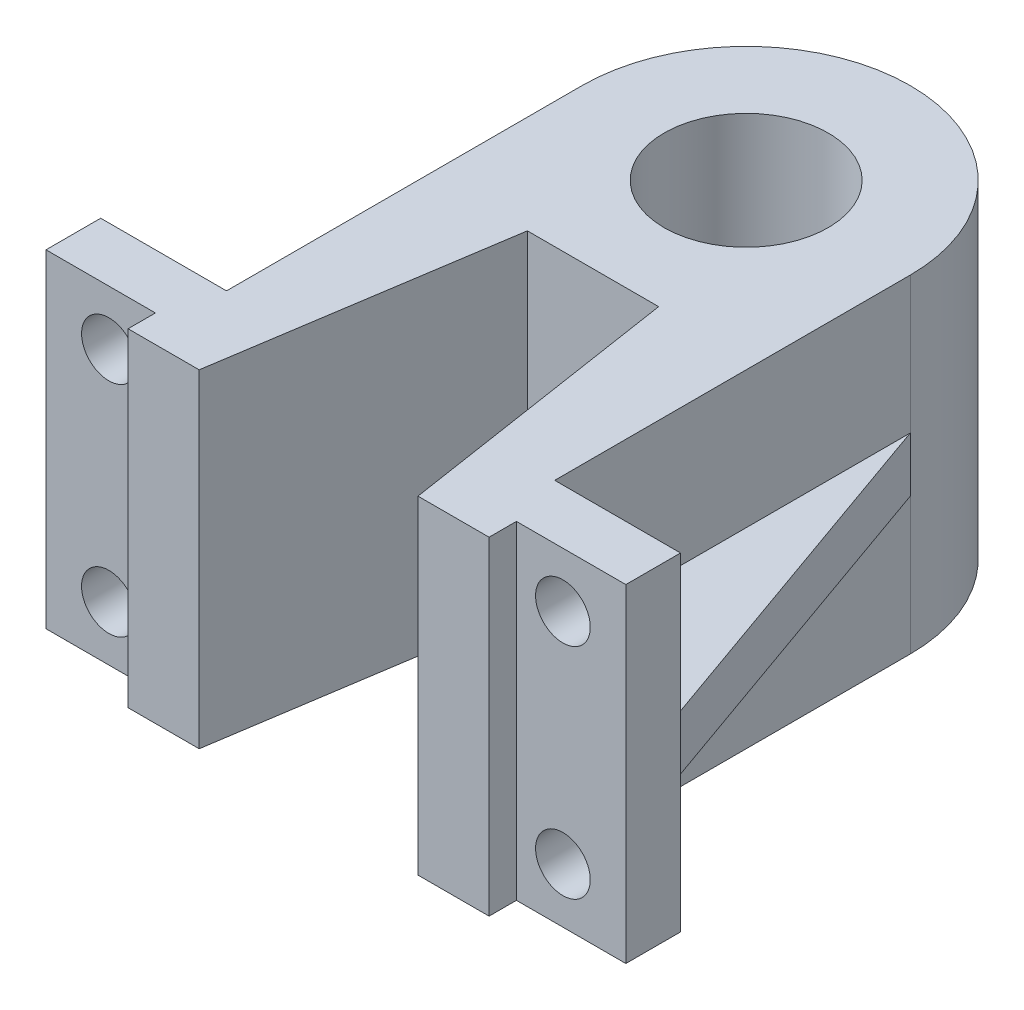
ISO-10303-21;
HEADER;
FILE_DESCRIPTION(('STEP AP214'),'2;1');
FILE_NAME('part.step','',(''),(''),'','','');
FILE_SCHEMA(('AUTOMOTIVE_DESIGN { 1 0 10303 214 1 1 1 1 }'));
ENDSEC;
DATA;
#1=APPLICATION_CONTEXT('core data for automotive mechanical design processes');
#2=APPLICATION_PROTOCOL_DEFINITION('international standard','automotive_design',2000,#1);
#3=PRODUCT_CONTEXT('',#1,'mechanical');
#4=PRODUCT('Part','Part','',(#3));
#5=PRODUCT_RELATED_PRODUCT_CATEGORY('part','',(#4));
#6=PRODUCT_DEFINITION_FORMATION('','',#4);
#7=PRODUCT_DEFINITION_CONTEXT('part definition',#1,'design');
#8=PRODUCT_DEFINITION('design','',#6,#7);
#9=PRODUCT_DEFINITION_SHAPE('','',#8);
#10=(LENGTH_UNIT() NAMED_UNIT(*) SI_UNIT(.MILLI.,.METRE.));
#11=(NAMED_UNIT(*) PLANE_ANGLE_UNIT() SI_UNIT($,.RADIAN.));
#12=(NAMED_UNIT(*) SI_UNIT($,.STERADIAN.) SOLID_ANGLE_UNIT());
#13=UNCERTAINTY_MEASURE_WITH_UNIT(LENGTH_MEASURE(1.E-05),#10,'distance_accuracy_value','');
#14=(GEOMETRIC_REPRESENTATION_CONTEXT(3) GLOBAL_UNCERTAINTY_ASSIGNED_CONTEXT((#13)) GLOBAL_UNIT_ASSIGNED_CONTEXT((#10,
#11,#12)) REPRESENTATION_CONTEXT('',''));
#15=CARTESIAN_POINT('',(0.,0.,0.));
#16=DIRECTION('',(0.,0.,1.));
#17=DIRECTION('',(1.,0.,0.));
#18=AXIS2_PLACEMENT_3D('',#15,#16,#17);
#19=CARTESIAN_POINT('',(0.,-60.,65.));
#20=DIRECTION('',(0.,0.,-1.));
#21=DIRECTION('',(-1.,0.,0.));
#22=AXIS2_PLACEMENT_3D('',#19,#20,#21);
#23=PLANE('',#22);
#24=CARTESIAN_POINT('',(-41.5,-50.,65.));
#25=DIRECTION('',(0.,0.,-1.));
#26=DIRECTION('',(-1.,0.,0.));
#27=AXIS2_PLACEMENT_3D('',#24,#25,#26);
#28=CIRCLE('',#27,5.);
#29=CARTESIAN_POINT('',(-46.5,-50.,65.));
#30=VERTEX_POINT('',#29);
#31=EDGE_CURVE('E372',#30,#30,#28,.T.);
#32=ORIENTED_EDGE('',*,*,#31,.F.);
#33=EDGE_LOOP('',(#32));
#34=FACE_BOUND('',#33,.T.);
#35=DIRECTION('',(0.,1.,0.));
#36=VECTOR('',#35,1.);
#37=CARTESIAN_POINT('',(-53.,-60.,65.));
#38=LINE('',#37,#36);
#39=CARTESIAN_POINT('',(-53.,-60.,65.));
#40=VERTEX_POINT('',#39);
#41=CARTESIAN_POINT('',(-53.,-35.,65.));
#42=VERTEX_POINT('',#41);
#43=EDGE_CURVE('E323',#40,#42,#38,.T.);
#44=ORIENTED_EDGE('',*,*,#43,.T.);
#45=DIRECTION('',(1.,0.,0.));
#46=VECTOR('',#45,1.);
#47=CARTESIAN_POINT('',(0.,-35.,65.));
#48=LINE('',#47,#46);
#49=CARTESIAN_POINT('',(-30.,-35.,65.));
#50=VERTEX_POINT('',#49);
#51=EDGE_CURVE('E206',#42,#50,#48,.T.);
#52=ORIENTED_EDGE('',*,*,#51,.T.);
#53=DIRECTION('',(0.,1.,0.));
#54=VECTOR('',#53,1.);
#55=CARTESIAN_POINT('',(-30.,-60.,65.));
#56=LINE('',#55,#54);
#57=CARTESIAN_POINT('',(-30.,-60.,65.));
#58=VERTEX_POINT('',#57);
#59=EDGE_CURVE('E213',#58,#50,#56,.T.);
#60=ORIENTED_EDGE('',*,*,#59,.F.);
#61=DIRECTION('',(-1.,0.,0.));
#62=VECTOR('',#61,1.);
#63=CARTESIAN_POINT('',(0.,-60.,65.));
#64=LINE('',#63,#62);
#65=EDGE_CURVE('E393',#58,#40,#64,.T.);
#66=ORIENTED_EDGE('',*,*,#65,.T.);
#67=EDGE_LOOP('',(#44,#52,#60,#66));
#68=FACE_BOUND('',#67,.T.);
#69=ADVANCED_FACE('F41',(#34,#68),#23,.T.);
#70=CARTESIAN_POINT('',(-30.,-60.,0.));
#71=DIRECTION('',(-1.,0.,0.));
#72=DIRECTION('',(0.,0.,1.));
#73=AXIS2_PLACEMENT_3D('',#70,#71,#72);
#74=PLANE('',#73);
#75=ORIENTED_EDGE('',*,*,#59,.T.);
#76=DIRECTION('',(0.,0.,-1.));
#77=VECTOR('',#76,1.);
#78=CARTESIAN_POINT('',(-30.,-35.,0.));
#79=LINE('',#78,#77);
#80=CARTESIAN_POINT('',(-30.,-35.,0.));
#81=VERTEX_POINT('',#80);
#82=EDGE_CURVE('E204',#50,#81,#79,.T.);
#83=ORIENTED_EDGE('',*,*,#82,.T.);
#84=DIRECTION('',(0.,1.,0.));
#85=VECTOR('',#84,1.);
#86=CARTESIAN_POINT('',(-30.,-60.,0.));
#87=LINE('',#86,#85);
#88=CARTESIAN_POINT('',(-30.,-60.,0.));
#89=VERTEX_POINT('',#88);
#90=EDGE_CURVE('E198',#89,#81,#87,.T.);
#91=ORIENTED_EDGE('',*,*,#90,.F.);
#92=DIRECTION('',(0.,0.,1.));
#93=VECTOR('',#92,1.);
#94=CARTESIAN_POINT('',(-30.,-60.,0.));
#95=LINE('',#94,#93);
#96=EDGE_CURVE('E391',#89,#58,#95,.T.);
#97=ORIENTED_EDGE('',*,*,#96,.T.);
#98=EDGE_LOOP('',(#75,#83,#91,#97));
#99=FACE_BOUND('',#98,.T.);
#100=ADVANCED_FACE('F210',(#99),#74,.T.);
#101=CARTESIAN_POINT('',(30.,-60.,0.));
#102=DIRECTION('',(-1.,0.,0.));
#103=DIRECTION('',(0.,0.,1.));
#104=AXIS2_PLACEMENT_3D('',#101,#102,#103);
#105=PLANE('',#104);
#106=DIRECTION('',(0.,0.,-1.));
#107=VECTOR('',#106,1.);
#108=CARTESIAN_POINT('',(30.,-35.,0.));
#109=LINE('',#108,#107);
#110=CARTESIAN_POINT('',(30.,-35.,65.));
#111=VERTEX_POINT('',#110);
#112=CARTESIAN_POINT('',(30.,-35.,0.));
#113=VERTEX_POINT('',#112);
#114=EDGE_CURVE('E359',#111,#113,#109,.T.);
#115=ORIENTED_EDGE('',*,*,#114,.F.);
#116=DIRECTION('',(0.,1.,0.));
#117=VECTOR('',#116,1.);
#118=CARTESIAN_POINT('',(30.,-60.,65.));
#119=LINE('',#118,#117);
#120=CARTESIAN_POINT('',(30.,-60.,65.));
#121=VERTEX_POINT('',#120);
#122=EDGE_CURVE('E11',#121,#111,#119,.T.);
#123=ORIENTED_EDGE('',*,*,#122,.F.);
#124=DIRECTION('',(0.,0.,1.));
#125=VECTOR('',#124,1.);
#126=CARTESIAN_POINT('',(30.,-60.,0.));
#127=LINE('',#126,#125);
#128=CARTESIAN_POINT('',(30.,-60.,0.));
#129=VERTEX_POINT('',#128);
#130=EDGE_CURVE('E388',#129,#121,#127,.T.);
#131=ORIENTED_EDGE('',*,*,#130,.F.);
#132=DIRECTION('',(0.,1.,0.));
#133=VECTOR('',#132,1.);
#134=CARTESIAN_POINT('',(30.,-60.,0.));
#135=LINE('',#134,#133);
#136=EDGE_CURVE('E223',#129,#113,#135,.T.);
#137=ORIENTED_EDGE('',*,*,#136,.T.);
#138=EDGE_LOOP('',(#115,#123,#131,#137));
#139=FACE_BOUND('',#138,.T.);
#140=ADVANCED_FACE('F478',(#139),#105,.F.);
#141=CARTESIAN_POINT('',(0.,-60.,65.));
#142=DIRECTION('',(0.,0.,1.));
#143=DIRECTION('',(1.,0.,0.));
#144=AXIS2_PLACEMENT_3D('',#141,#142,#143);
#145=PLANE('',#144);
#146=CARTESIAN_POINT('',(41.5,-50.,65.));
#147=DIRECTION('',(0.,0.,-1.));
#148=DIRECTION('',(1.,0.,0.));
#149=AXIS2_PLACEMENT_3D('',#146,#147,#148);
#150=CIRCLE('',#149,5.);
#151=CARTESIAN_POINT('',(46.5,-50.,65.));
#152=VERTEX_POINT('',#151);
#153=EDGE_CURVE('E367',#152,#152,#150,.T.);
#154=ORIENTED_EDGE('',*,*,#153,.F.);
#155=EDGE_LOOP('',(#154));
#156=FACE_BOUND('',#155,.T.);
#157=DIRECTION('',(-1.,0.,0.));
#158=VECTOR('',#157,1.);
#159=CARTESIAN_POINT('',(0.,-35.,65.));
#160=LINE('',#159,#158);
#161=CARTESIAN_POINT('',(53.,-35.,65.));
#162=VERTEX_POINT('',#161);
#163=EDGE_CURVE('E354',#162,#111,#160,.T.);
#164=ORIENTED_EDGE('',*,*,#163,.F.);
#165=DIRECTION('',(0.,1.,0.));
#166=VECTOR('',#165,1.);
#167=CARTESIAN_POINT('',(53.,-60.,65.));
#168=LINE('',#167,#166);
#169=CARTESIAN_POINT('',(53.,-60.,65.));
#170=VERTEX_POINT('',#169);
#171=EDGE_CURVE('E299',#170,#162,#168,.T.);
#172=ORIENTED_EDGE('',*,*,#171,.F.);
#173=DIRECTION('',(1.,0.,0.));
#174=VECTOR('',#173,1.);
#175=CARTESIAN_POINT('',(0.,-60.,65.));
#176=LINE('',#175,#174);
#177=EDGE_CURVE('E234',#121,#170,#176,.T.);
#178=ORIENTED_EDGE('',*,*,#177,.F.);
#179=ORIENTED_EDGE('',*,*,#122,.T.);
#180=EDGE_LOOP('',(#164,#172,#178,#179));
#181=FACE_BOUND('',#180,.T.);
#182=ADVANCED_FACE('F532',(#156,#181),#145,.F.);
#183=CARTESIAN_POINT('',(30.,-25.,65.));
#184=VERTEX_POINT('',#183);
#185=CARTESIAN_POINT('',(30.,0.,65.));
#186=VERTEX_POINT('',#185);
#187=EDGE_CURVE('E50',#184,#186,#119,.T.);
#188=ORIENTED_EDGE('',*,*,#187,.F.);
#189=DIRECTION('',(0.,0.,-1.));
#190=VECTOR('',#189,1.);
#191=CARTESIAN_POINT('',(30.,-25.,0.));
#192=LINE('',#191,#190);
#193=CARTESIAN_POINT('',(30.,-25.,0.));
#194=VERTEX_POINT('',#193);
#195=EDGE_CURVE('E362',#184,#194,#192,.T.);
#196=ORIENTED_EDGE('',*,*,#195,.T.);
#197=CARTESIAN_POINT('',(30.,0.,0.));
#198=VERTEX_POINT('',#197);
#199=EDGE_CURVE('E229',#194,#198,#135,.T.);
#200=ORIENTED_EDGE('',*,*,#199,.T.);
#201=DIRECTION('',(0.,0.,1.));
#202=VECTOR('',#201,1.);
#203=CARTESIAN_POINT('',(30.,0.,0.));
#204=LINE('',#203,#202);
#205=EDGE_CURVE('E251',#198,#186,#204,.T.);
#206=ORIENTED_EDGE('',*,*,#205,.T.);
#207=EDGE_LOOP('',(#188,#196,#200,#206));
#208=FACE_BOUND('',#207,.T.);
#209=ADVANCED_FACE('F470',(#208),#105,.F.);
#210=CARTESIAN_POINT('',(41.5,-10.,65.));
#211=DIRECTION('',(0.,0.,-1.));
#212=DIRECTION('',(-1.,0.,0.));
#213=AXIS2_PLACEMENT_3D('',#210,#211,#212);
#214=CIRCLE('',#213,5.);
#215=CARTESIAN_POINT('',(36.5,-10.,65.));
#216=VERTEX_POINT('',#215);
#217=EDGE_CURVE('E371',#216,#216,#214,.T.);
#218=ORIENTED_EDGE('',*,*,#217,.F.);
#219=EDGE_LOOP('',(#218));
#220=FACE_BOUND('',#219,.T.);
#221=CARTESIAN_POINT('',(53.,-25.,65.));
#222=VERTEX_POINT('',#221);
#223=CARTESIAN_POINT('',(53.,0.,65.));
#224=VERTEX_POINT('',#223);
#225=EDGE_CURVE('E302',#222,#224,#168,.T.);
#226=ORIENTED_EDGE('',*,*,#225,.F.);
#227=DIRECTION('',(-1.,0.,0.));
#228=VECTOR('',#227,1.);
#229=CARTESIAN_POINT('',(0.,-25.,65.));
#230=LINE('',#229,#228);
#231=EDGE_CURVE('E66',#222,#184,#230,.T.);
#232=ORIENTED_EDGE('',*,*,#231,.T.);
#233=ORIENTED_EDGE('',*,*,#187,.T.);
#234=DIRECTION('',(1.,0.,0.));
#235=VECTOR('',#234,1.);
#236=CARTESIAN_POINT('',(0.,0.,65.));
#237=LINE('',#236,#235);
#238=EDGE_CURVE('E295',#186,#224,#237,.T.);
#239=ORIENTED_EDGE('',*,*,#238,.T.);
#240=EDGE_LOOP('',(#226,#232,#233,#239));
#241=FACE_BOUND('',#240,.T.);
#242=ADVANCED_FACE('F468',(#220,#241),#145,.F.);
#243=CARTESIAN_POINT('',(53.,-60.,0.));
#244=DIRECTION('',(-1.,0.,0.));
#245=DIRECTION('',(0.,0.,1.));
#246=AXIS2_PLACEMENT_3D('',#243,#244,#245);
#247=PLANE('',#246);
#248=DIRECTION('',(0.,0.,1.));
#249=VECTOR('',#248,1.);
#250=CARTESIAN_POINT('',(53.,0.,0.));
#251=LINE('',#250,#249);
#252=CARTESIAN_POINT('',(53.,0.,75.));
#253=VERTEX_POINT('',#252);
#254=EDGE_CURVE('E292',#224,#253,#251,.T.);
#255=ORIENTED_EDGE('',*,*,#254,.T.);
#256=DIRECTION('',(0.,1.,0.));
#257=VECTOR('',#256,1.);
#258=CARTESIAN_POINT('',(53.,-60.,75.));
#259=LINE('',#258,#257);
#260=CARTESIAN_POINT('',(53.,-60.,75.));
#261=VERTEX_POINT('',#260);
#262=EDGE_CURVE('E303',#261,#253,#259,.T.);
#263=ORIENTED_EDGE('',*,*,#262,.F.);
#264=DIRECTION('',(0.,0.,1.));
#265=VECTOR('',#264,1.);
#266=CARTESIAN_POINT('',(53.,-60.,0.));
#267=LINE('',#266,#265);
#268=EDGE_CURVE('E239',#170,#261,#267,.T.);
#269=ORIENTED_EDGE('',*,*,#268,.F.);
#270=ORIENTED_EDGE('',*,*,#171,.T.);
#271=DIRECTION('',(0.,1.,0.));
#272=VECTOR('',#271,1.);
#273=CARTESIAN_POINT('',(53.,-60.,65.));
#274=LINE('',#273,#272);
#275=EDGE_CURVE('E364',#222,#162,#274,.F.);
#276=ORIENTED_EDGE('',*,*,#275,.F.);
#277=ORIENTED_EDGE('',*,*,#225,.T.);
#278=EDGE_LOOP('',(#255,#263,#269,#270,#276,#277));
#279=FACE_BOUND('',#278,.T.);
#280=ADVANCED_FACE('F466',(#279),#247,.F.);
#281=CARTESIAN_POINT('',(0.,-60.,75.));
#282=DIRECTION('',(0.,0.,-1.));
#283=DIRECTION('',(-1.,0.,0.));
#284=AXIS2_PLACEMENT_3D('',#281,#282,#283);
#285=PLANE('',#284);
#286=CARTESIAN_POINT('',(41.5,-10.,75.));
#287=DIRECTION('',(0.,0.,-1.));
#288=DIRECTION('',(-1.,0.,0.));
#289=AXIS2_PLACEMENT_3D('',#286,#287,#288);
#290=CIRCLE('',#289,5.);
#291=CARTESIAN_POINT('',(36.5,-10.,75.));
#292=VERTEX_POINT('',#291);
#293=EDGE_CURVE('E385',#292,#292,#290,.T.);
#294=ORIENTED_EDGE('',*,*,#293,.T.);
#295=EDGE_LOOP('',(#294));
#296=FACE_BOUND('',#295,.T.);
#297=DIRECTION('',(-1.,0.,0.));
#298=VECTOR('',#297,1.);
#299=CARTESIAN_POINT('',(0.,0.,75.));
#300=LINE('',#299,#298);
#301=CARTESIAN_POINT('',(33.,0.,75.));
#302=VERTEX_POINT('',#301);
#303=EDGE_CURVE('E289',#253,#302,#300,.T.);
#304=ORIENTED_EDGE('',*,*,#303,.T.);
#305=DIRECTION('',(0.,1.,0.));
#306=VECTOR('',#305,1.);
#307=CARTESIAN_POINT('',(33.,-60.,75.));
#308=LINE('',#307,#306);
#309=CARTESIAN_POINT('',(33.,-60.,75.));
#310=VERTEX_POINT('',#309);
#311=EDGE_CURVE('E305',#310,#302,#308,.T.);
#312=ORIENTED_EDGE('',*,*,#311,.F.);
#313=DIRECTION('',(-1.,0.,0.));
#314=VECTOR('',#313,1.);
#315=CARTESIAN_POINT('',(0.,-60.,75.));
#316=LINE('',#315,#314);
#317=EDGE_CURVE('E244',#261,#310,#316,.T.);
#318=ORIENTED_EDGE('',*,*,#317,.F.);
#319=ORIENTED_EDGE('',*,*,#262,.T.);
#320=EDGE_LOOP('',(#304,#312,#318,#319));
#321=FACE_BOUND('',#320,.T.);
#322=CARTESIAN_POINT('',(41.5,-50.,75.));
#323=DIRECTION('',(0.,0.,-1.));
#324=DIRECTION('',(-1.,0.,0.));
#325=AXIS2_PLACEMENT_3D('',#322,#323,#324);
#326=CIRCLE('',#325,5.);
#327=CARTESIAN_POINT('',(36.5,-50.,75.));
#328=VERTEX_POINT('',#327);
#329=EDGE_CURVE('E45',#328,#328,#326,.T.);
#330=ORIENTED_EDGE('',*,*,#329,.T.);
#331=EDGE_LOOP('',(#330));
#332=FACE_BOUND('',#331,.T.);
#333=ADVANCED_FACE('F426',(#296,#321,#332),#285,.F.);
#334=CARTESIAN_POINT('',(33.,-60.,0.));
#335=DIRECTION('',(-1.,0.,0.));
#336=DIRECTION('',(0.,0.,1.));
#337=AXIS2_PLACEMENT_3D('',#334,#335,#336);
#338=PLANE('',#337);
#339=DIRECTION('',(0.,0.,1.));
#340=VECTOR('',#339,1.);
#341=CARTESIAN_POINT('',(33.,0.,0.));
#342=LINE('',#341,#340);
#343=CARTESIAN_POINT('',(33.,0.,80.));
#344=VERTEX_POINT('',#343);
#345=EDGE_CURVE('E286',#302,#344,#342,.T.);
#346=ORIENTED_EDGE('',*,*,#345,.T.);
#347=DIRECTION('',(0.,1.,0.));
#348=VECTOR('',#347,1.);
#349=CARTESIAN_POINT('',(33.,-60.,80.));
#350=LINE('',#349,#348);
#351=CARTESIAN_POINT('',(33.,-60.,80.));
#352=VERTEX_POINT('',#351);
#353=EDGE_CURVE('E307',#352,#344,#350,.T.);
#354=ORIENTED_EDGE('',*,*,#353,.F.);
#355=DIRECTION('',(0.,0.,1.));
#356=VECTOR('',#355,1.);
#357=CARTESIAN_POINT('',(33.,-60.,0.));
#358=LINE('',#357,#356);
#359=EDGE_CURVE('E417',#310,#352,#358,.T.);
#360=ORIENTED_EDGE('',*,*,#359,.F.);
#361=ORIENTED_EDGE('',*,*,#311,.T.);
#362=EDGE_LOOP('',(#346,#354,#360,#361));
#363=FACE_BOUND('',#362,.T.);
#364=ADVANCED_FACE('F431',(#363),#338,.F.);
#365=CARTESIAN_POINT('',(0.,-60.,80.));
#366=DIRECTION('',(0.,0.,-1.));
#367=DIRECTION('',(-1.,0.,0.));
#368=AXIS2_PLACEMENT_3D('',#365,#366,#367);
#369=PLANE('',#368);
#370=DIRECTION('',(-1.,0.,0.));
#371=VECTOR('',#370,1.);
#372=CARTESIAN_POINT('',(0.,0.,80.));
#373=LINE('',#372,#371);
#374=CARTESIAN_POINT('',(20.,0.,80.));
#375=VERTEX_POINT('',#374);
#376=EDGE_CURVE('E283',#344,#375,#373,.T.);
#377=ORIENTED_EDGE('',*,*,#376,.T.);
#378=DIRECTION('',(0.,1.,0.));
#379=VECTOR('',#378,1.);
#380=CARTESIAN_POINT('',(20.,-60.,80.));
#381=LINE('',#380,#379);
#382=CARTESIAN_POINT('',(20.,-60.,80.));
#383=VERTEX_POINT('',#382);
#384=EDGE_CURVE('E309',#383,#375,#381,.T.);
#385=ORIENTED_EDGE('',*,*,#384,.F.);
#386=DIRECTION('',(-1.,0.,0.));
#387=VECTOR('',#386,1.);
#388=CARTESIAN_POINT('',(0.,-60.,80.));
#389=LINE('',#388,#387);
#390=EDGE_CURVE('E415',#352,#383,#389,.T.);
#391=ORIENTED_EDGE('',*,*,#390,.F.);
#392=ORIENTED_EDGE('',*,*,#353,.T.);
#393=EDGE_LOOP('',(#377,#385,#391,#392));
#394=FACE_BOUND('',#393,.T.);
#395=ADVANCED_FACE('F436',(#394),#369,.F.);
#396=CARTESIAN_POINT('',(7.51445086705202,-60.,-1.15606936416185));
#397=DIRECTION('',(0.988371697650617,0.,-0.152057184253941));
#398=DIRECTION('',(-0.152057184253941,0.,-0.988371697650617));
#399=AXIS2_PLACEMENT_3D('',#396,#397,#398);
#400=PLANE('',#399);
#401=DIRECTION('',(-0.152057184253941,0.,-0.988371697650617));
#402=VECTOR('',#401,1.);
#403=CARTESIAN_POINT('',(7.51445086705202,0.,-1.15606936416185));
#404=LINE('',#403,#402);
#405=CARTESIAN_POINT('',(12.,0.,28.));
#406=VERTEX_POINT('',#405);
#407=EDGE_CURVE('E280',#375,#406,#404,.T.);
#408=ORIENTED_EDGE('',*,*,#407,.T.);
#409=DIRECTION('',(0.,1.,0.));
#410=VECTOR('',#409,1.);
#411=CARTESIAN_POINT('',(12.,-60.,28.));
#412=LINE('',#411,#410);
#413=CARTESIAN_POINT('',(12.,-60.,28.));
#414=VERTEX_POINT('',#413);
#415=EDGE_CURVE('E311',#414,#406,#412,.T.);
#416=ORIENTED_EDGE('',*,*,#415,.F.);
#417=DIRECTION('',(-0.152057184253941,0.,-0.988371697650617));
#418=VECTOR('',#417,1.);
#419=CARTESIAN_POINT('',(7.51445086705202,-60.,-1.15606936416185));
#420=LINE('',#419,#418);
#421=EDGE_CURVE('E413',#383,#414,#420,.T.);
#422=ORIENTED_EDGE('',*,*,#421,.F.);
#423=ORIENTED_EDGE('',*,*,#384,.T.);
#424=EDGE_LOOP('',(#408,#416,#422,#423));
#425=FACE_BOUND('',#424,.T.);
#426=ADVANCED_FACE('F442',(#425),#400,.F.);
#427=CARTESIAN_POINT('',(0.,-60.,28.));
#428=DIRECTION('',(0.,0.,1.));
#429=DIRECTION('',(1.,0.,0.));
#430=AXIS2_PLACEMENT_3D('',#427,#428,#429);
#431=PLANE('',#430);
#432=DIRECTION('',(1.,0.,0.));
#433=VECTOR('',#432,1.);
#434=CARTESIAN_POINT('',(0.,0.,28.));
#435=LINE('',#434,#433);
#436=CARTESIAN_POINT('',(-12.,0.,28.));
#437=VERTEX_POINT('',#436);
#438=EDGE_CURVE('E277',#437,#406,#435,.T.);
#439=ORIENTED_EDGE('',*,*,#438,.F.);
#440=DIRECTION('',(0.,1.,0.));
#441=VECTOR('',#440,1.);
#442=CARTESIAN_POINT('',(-12.,-60.,28.));
#443=LINE('',#442,#441);
#444=CARTESIAN_POINT('',(-12.,-60.,28.));
#445=VERTEX_POINT('',#444);
#446=EDGE_CURVE('E313',#445,#437,#443,.T.);
#447=ORIENTED_EDGE('',*,*,#446,.F.);
#448=DIRECTION('',(1.,0.,0.));
#449=VECTOR('',#448,1.);
#450=CARTESIAN_POINT('',(0.,-60.,28.));
#451=LINE('',#450,#449);
#452=EDGE_CURVE('E410',#445,#414,#451,.T.);
#453=ORIENTED_EDGE('',*,*,#452,.T.);
#454=ORIENTED_EDGE('',*,*,#415,.T.);
#455=EDGE_LOOP('',(#439,#447,#453,#454));
#456=FACE_BOUND('',#455,.T.);
#457=ADVANCED_FACE('F446',(#456),#431,.T.);
#458=CARTESIAN_POINT('',(-7.51445086705202,-60.,-1.15606936416185));
#459=DIRECTION('',(0.988371697650617,0.,0.152057184253941));
#460=DIRECTION('',(0.152057184253941,0.,-0.988371697650617));
#461=AXIS2_PLACEMENT_3D('',#458,#459,#460);
#462=PLANE('',#461);
#463=DIRECTION('',(0.152057184253941,0.,-0.988371697650617));
#464=VECTOR('',#463,1.);
#465=CARTESIAN_POINT('',(-7.51445086705202,0.,-1.15606936416185));
#466=LINE('',#465,#464);
#467=CARTESIAN_POINT('',(-20.,0.,80.));
#468=VERTEX_POINT('',#467);
#469=EDGE_CURVE('E274',#468,#437,#466,.T.);
#470=ORIENTED_EDGE('',*,*,#469,.F.);
#471=DIRECTION('',(0.,1.,0.));
#472=VECTOR('',#471,1.);
#473=CARTESIAN_POINT('',(-20.,-60.,80.));
#474=LINE('',#473,#472);
#475=CARTESIAN_POINT('',(-20.,-60.,80.));
#476=VERTEX_POINT('',#475);
#477=EDGE_CURVE('E315',#476,#468,#474,.T.);
#478=ORIENTED_EDGE('',*,*,#477,.F.);
#479=DIRECTION('',(0.152057184253941,0.,-0.988371697650617));
#480=VECTOR('',#479,1.);
#481=CARTESIAN_POINT('',(-7.51445086705202,-60.,-1.15606936416185));
#482=LINE('',#481,#480);
#483=EDGE_CURVE('E407',#476,#445,#482,.T.);
#484=ORIENTED_EDGE('',*,*,#483,.T.);
#485=ORIENTED_EDGE('',*,*,#446,.T.);
#486=EDGE_LOOP('',(#470,#478,#484,#485));
#487=FACE_BOUND('',#486,.T.);
#488=ADVANCED_FACE('F449',(#487),#462,.T.);
#489=CARTESIAN_POINT('',(0.,-60.,80.));
#490=DIRECTION('',(0.,0.,1.));
#491=DIRECTION('',(1.,0.,0.));
#492=AXIS2_PLACEMENT_3D('',#489,#490,#491);
#493=PLANE('',#492);
#494=DIRECTION('',(1.,0.,0.));
#495=VECTOR('',#494,1.);
#496=CARTESIAN_POINT('',(0.,0.,80.));
#497=LINE('',#496,#495);
#498=CARTESIAN_POINT('',(-33.,0.,80.));
#499=VERTEX_POINT('',#498);
#500=EDGE_CURVE('E271',#499,#468,#497,.T.);
#501=ORIENTED_EDGE('',*,*,#500,.F.);
#502=DIRECTION('',(0.,1.,0.));
#503=VECTOR('',#502,1.);
#504=CARTESIAN_POINT('',(-33.,-60.,80.));
#505=LINE('',#504,#503);
#506=CARTESIAN_POINT('',(-33.,-60.,80.));
#507=VERTEX_POINT('',#506);
#508=EDGE_CURVE('E317',#507,#499,#505,.T.);
#509=ORIENTED_EDGE('',*,*,#508,.F.);
#510=DIRECTION('',(1.,0.,0.));
#511=VECTOR('',#510,1.);
#512=CARTESIAN_POINT('',(0.,-60.,80.));
#513=LINE('',#512,#511);
#514=EDGE_CURVE('E404',#507,#476,#513,.T.);
#515=ORIENTED_EDGE('',*,*,#514,.T.);
#516=ORIENTED_EDGE('',*,*,#477,.T.);
#517=EDGE_LOOP('',(#501,#509,#515,#516));
#518=FACE_BOUND('',#517,.T.);
#519=ADVANCED_FACE('F454',(#518),#493,.T.);
#520=CARTESIAN_POINT('',(-33.,-60.,0.));
#521=DIRECTION('',(-1.,0.,0.));
#522=DIRECTION('',(0.,0.,1.));
#523=AXIS2_PLACEMENT_3D('',#520,#521,#522);
#524=PLANE('',#523);
#525=DIRECTION('',(0.,0.,1.));
#526=VECTOR('',#525,1.);
#527=CARTESIAN_POINT('',(-33.,0.,0.));
#528=LINE('',#527,#526);
#529=CARTESIAN_POINT('',(-33.,0.,75.));
#530=VERTEX_POINT('',#529);
#531=EDGE_CURVE('E268',#530,#499,#528,.T.);
#532=ORIENTED_EDGE('',*,*,#531,.F.);
#533=DIRECTION('',(0.,1.,0.));
#534=VECTOR('',#533,1.);
#535=CARTESIAN_POINT('',(-33.,-60.,75.));
#536=LINE('',#535,#534);
#537=CARTESIAN_POINT('',(-33.,-60.,75.));
#538=VERTEX_POINT('',#537);
#539=EDGE_CURVE('E319',#538,#530,#536,.T.);
#540=ORIENTED_EDGE('',*,*,#539,.F.);
#541=DIRECTION('',(0.,0.,1.));
#542=VECTOR('',#541,1.);
#543=CARTESIAN_POINT('',(-33.,-60.,0.));
#544=LINE('',#543,#542);
#545=EDGE_CURVE('E401',#538,#507,#544,.T.);
#546=ORIENTED_EDGE('',*,*,#545,.T.);
#547=ORIENTED_EDGE('',*,*,#508,.T.);
#548=EDGE_LOOP('',(#532,#540,#546,#547));
#549=FACE_BOUND('',#548,.T.);
#550=ADVANCED_FACE('F457',(#549),#524,.T.);
#551=CARTESIAN_POINT('',(0.,-60.,75.));
#552=DIRECTION('',(0.,0.,1.));
#553=DIRECTION('',(1.,0.,0.));
#554=AXIS2_PLACEMENT_3D('',#551,#552,#553);
#555=PLANE('',#554);
#556=DIRECTION('',(1.,0.,0.));
#557=VECTOR('',#556,1.);
#558=CARTESIAN_POINT('',(0.,0.,75.));
#559=LINE('',#558,#557);
#560=CARTESIAN_POINT('',(-53.,0.,75.));
#561=VERTEX_POINT('',#560);
#562=EDGE_CURVE('E265',#561,#530,#559,.T.);
#563=ORIENTED_EDGE('',*,*,#562,.F.);
#564=DIRECTION('',(0.,1.,0.));
#565=VECTOR('',#564,1.);
#566=CARTESIAN_POINT('',(-53.,-60.,75.));
#567=LINE('',#566,#565);
#568=CARTESIAN_POINT('',(-53.,-60.,75.));
#569=VERTEX_POINT('',#568);
#570=EDGE_CURVE('E321',#569,#561,#567,.T.);
#571=ORIENTED_EDGE('',*,*,#570,.F.);
#572=DIRECTION('',(1.,0.,0.));
#573=VECTOR('',#572,1.);
#574=CARTESIAN_POINT('',(0.,-60.,75.));
#575=LINE('',#574,#573);
#576=EDGE_CURVE('E398',#569,#538,#575,.T.);
#577=ORIENTED_EDGE('',*,*,#576,.T.);
#578=ORIENTED_EDGE('',*,*,#539,.T.);
#579=EDGE_LOOP('',(#563,#571,#577,#578));
#580=FACE_BOUND('',#579,.T.);
#581=CARTESIAN_POINT('',(-41.5,-10.,75.));
#582=DIRECTION('',(0.,0.,1.));
#583=DIRECTION('',(1.,0.,0.));
#584=AXIS2_PLACEMENT_3D('',#581,#582,#583);
#585=CIRCLE('',#584,5.);
#586=CARTESIAN_POINT('',(-36.5,-10.,75.));
#587=VERTEX_POINT('',#586);
#588=EDGE_CURVE('E379',#587,#587,#585,.T.);
#589=ORIENTED_EDGE('',*,*,#588,.F.);
#590=EDGE_LOOP('',(#589));
#591=FACE_BOUND('',#590,.T.);
#592=CARTESIAN_POINT('',(-41.5,-50.,75.));
#593=DIRECTION('',(0.,0.,1.));
#594=DIRECTION('',(1.,0.,0.));
#595=AXIS2_PLACEMENT_3D('',#592,#593,#594);
#596=CIRCLE('',#595,5.);
#597=CARTESIAN_POINT('',(-36.5,-50.,75.));
#598=VERTEX_POINT('',#597);
#599=EDGE_CURVE('E382',#598,#598,#596,.T.);
#600=ORIENTED_EDGE('',*,*,#599,.F.);
#601=EDGE_LOOP('',(#600));
#602=FACE_BOUND('',#601,.T.);
#603=ADVANCED_FACE('F461',(#580,#591,#602),#555,.T.);
#604=CARTESIAN_POINT('',(-53.,-60.,0.));
#605=DIRECTION('',(-1.,0.,0.));
#606=DIRECTION('',(0.,0.,1.));
#607=AXIS2_PLACEMENT_3D('',#604,#605,#606);
#608=PLANE('',#607);
#609=CARTESIAN_POINT('',(-53.,-25.,65.));
#610=VERTEX_POINT('',#609);
#611=CARTESIAN_POINT('',(-53.,0.,65.));
#612=VERTEX_POINT('',#611);
#613=EDGE_CURVE('E325',#610,#612,#38,.T.);
#614=ORIENTED_EDGE('',*,*,#613,.F.);
#615=DIRECTION('',(0.,1.,0.));
#616=VECTOR('',#615,1.);
#617=CARTESIAN_POINT('',(-53.,-60.,65.));
#618=LINE('',#617,#616);
#619=EDGE_CURVE('E345',#42,#610,#618,.T.);
#620=ORIENTED_EDGE('',*,*,#619,.F.);
#621=ORIENTED_EDGE('',*,*,#43,.F.);
#622=DIRECTION('',(0.,0.,1.));
#623=VECTOR('',#622,1.);
#624=CARTESIAN_POINT('',(-53.,-60.,0.));
#625=LINE('',#624,#623);
#626=EDGE_CURVE('E396',#40,#569,#625,.T.);
#627=ORIENTED_EDGE('',*,*,#626,.T.);
#628=ORIENTED_EDGE('',*,*,#570,.T.);
#629=DIRECTION('',(0.,0.,1.));
#630=VECTOR('',#629,1.);
#631=CARTESIAN_POINT('',(-53.,0.,0.));
#632=LINE('',#631,#630);
#633=EDGE_CURVE('E262',#612,#561,#632,.T.);
#634=ORIENTED_EDGE('',*,*,#633,.F.);
#635=EDGE_LOOP('',(#614,#620,#621,#627,#628,#634));
#636=FACE_BOUND('',#635,.T.);
#637=ADVANCED_FACE('F335',(#636),#608,.T.);
#638=DIRECTION('',(1.,0.,0.));
#639=VECTOR('',#638,1.);
#640=CARTESIAN_POINT('',(0.,-25.,65.));
#641=LINE('',#640,#639);
#642=CARTESIAN_POINT('',(-30.,-25.,65.));
#643=VERTEX_POINT('',#642);
#644=EDGE_CURVE('E214',#610,#643,#641,.T.);
#645=ORIENTED_EDGE('',*,*,#644,.F.);
#646=ORIENTED_EDGE('',*,*,#613,.T.);
#647=DIRECTION('',(-1.,0.,0.));
#648=VECTOR('',#647,1.);
#649=CARTESIAN_POINT('',(0.,0.,65.));
#650=LINE('',#649,#648);
#651=CARTESIAN_POINT('',(-30.,0.,65.));
#652=VERTEX_POINT('',#651);
#653=EDGE_CURVE('E259',#652,#612,#650,.T.);
#654=ORIENTED_EDGE('',*,*,#653,.F.);
#655=EDGE_CURVE('E220',#643,#652,#56,.T.);
#656=ORIENTED_EDGE('',*,*,#655,.F.);
#657=EDGE_LOOP('',(#645,#646,#654,#656));
#658=FACE_BOUND('',#657,.T.);
#659=CARTESIAN_POINT('',(-41.5,-10.,65.));
#660=DIRECTION('',(0.,0.,-1.));
#661=DIRECTION('',(1.,0.,0.));
#662=AXIS2_PLACEMENT_3D('',#659,#660,#661);
#663=CIRCLE('',#662,5.);
#664=CARTESIAN_POINT('',(-36.5,-10.,65.));
#665=VERTEX_POINT('',#664);
#666=EDGE_CURVE('E368',#665,#665,#663,.T.);
#667=ORIENTED_EDGE('',*,*,#666,.F.);
#668=EDGE_LOOP('',(#667));
#669=FACE_BOUND('',#668,.T.);
#670=ADVANCED_FACE('F331',(#658,#669),#23,.T.);
#671=DIRECTION('',(0.,0.,-1.));
#672=VECTOR('',#671,1.);
#673=CARTESIAN_POINT('',(-30.,-25.,0.));
#674=LINE('',#673,#672);
#675=CARTESIAN_POINT('',(-30.,-25.,0.));
#676=VERTEX_POINT('',#675);
#677=EDGE_CURVE('E343',#643,#676,#674,.T.);
#678=ORIENTED_EDGE('',*,*,#677,.F.);
#679=ORIENTED_EDGE('',*,*,#655,.T.);
#680=DIRECTION('',(0.,0.,1.));
#681=VECTOR('',#680,1.);
#682=CARTESIAN_POINT('',(-30.,0.,0.));
#683=LINE('',#682,#681);
#684=CARTESIAN_POINT('',(-30.,0.,0.));
#685=VERTEX_POINT('',#684);
#686=EDGE_CURVE('E256',#685,#652,#683,.T.);
#687=ORIENTED_EDGE('',*,*,#686,.F.);
#688=EDGE_CURVE('E199',#676,#685,#87,.T.);
#689=ORIENTED_EDGE('',*,*,#688,.F.);
#690=EDGE_LOOP('',(#678,#679,#687,#689));
#691=FACE_BOUND('',#690,.T.);
#692=ADVANCED_FACE('F342',(#691),#74,.T.);
#693=CARTESIAN_POINT('',(0.,-60.,0.));
#694=DIRECTION('',(0.,1.,0.));
#695=DIRECTION('',(0.,0.,1.));
#696=AXIS2_PLACEMENT_3D('',#693,#694,#695);
#697=CYLINDRICAL_SURFACE('',#696,15.);
#698=CARTESIAN_POINT('',(0.,0.,0.));
#699=DIRECTION('',(0.,1.,0.));
#700=DIRECTION('',(0.,0.,1.));
#701=AXIS2_PLACEMENT_3D('',#698,#699,#700);
#702=CIRCLE('',#701,15.);
#703=CARTESIAN_POINT('',(0.,0.,15.));
#704=VERTEX_POINT('',#703);
#705=EDGE_CURVE('E248',#704,#704,#702,.T.);
#706=ORIENTED_EDGE('',*,*,#705,.T.);
#707=EDGE_LOOP('',(#706));
#708=FACE_BOUND('',#707,.T.);
#709=CARTESIAN_POINT('',(0.,-60.,0.));
#710=DIRECTION('',(0.,1.,0.));
#711=DIRECTION('',(0.,0.,1.));
#712=AXIS2_PLACEMENT_3D('',#709,#710,#711);
#713=CIRCLE('',#712,15.);
#714=CARTESIAN_POINT('',(0.,-60.,15.));
#715=VERTEX_POINT('',#714);
#716=EDGE_CURVE('E297',#715,#715,#713,.T.);
#717=ORIENTED_EDGE('',*,*,#716,.F.);
#718=EDGE_LOOP('',(#717));
#719=FACE_BOUND('',#718,.T.);
#720=ADVANCED_FACE('F43',(#708,#719),#697,.F.);
#721=CARTESIAN_POINT('',(0.,-60.,0.));
#722=DIRECTION('',(0.,1.,0.));
#723=DIRECTION('',(0.,0.,1.));
#724=AXIS2_PLACEMENT_3D('',#721,#722,#723);
#725=CYLINDRICAL_SURFACE('',#724,30.);
#726=ORIENTED_EDGE('',*,*,#199,.F.);
#727=EDGE_CURVE('E228',#113,#194,#135,.T.);
#728=ORIENTED_EDGE('',*,*,#727,.F.);
#729=ORIENTED_EDGE('',*,*,#136,.F.);
#730=CARTESIAN_POINT('',(0.,-60.,0.));
#731=DIRECTION('',(0.,1.,0.));
#732=DIRECTION('',(0.,0.,1.));
#733=AXIS2_PLACEMENT_3D('',#730,#731,#732);
#734=CIRCLE('',#733,30.);
#735=EDGE_CURVE('E219',#129,#89,#734,.T.);
#736=ORIENTED_EDGE('',*,*,#735,.T.);
#737=ORIENTED_EDGE('',*,*,#90,.T.);
#738=EDGE_CURVE('E191',#81,#676,#87,.T.);
#739=ORIENTED_EDGE('',*,*,#738,.T.);
#740=ORIENTED_EDGE('',*,*,#688,.T.);
#741=CARTESIAN_POINT('',(0.,0.,0.));
#742=DIRECTION('',(0.,1.,0.));
#743=DIRECTION('',(0.,0.,1.));
#744=AXIS2_PLACEMENT_3D('',#741,#742,#743);
#745=CIRCLE('',#744,30.);
#746=EDGE_CURVE('E253',#198,#685,#745,.T.);
#747=ORIENTED_EDGE('',*,*,#746,.F.);
#748=EDGE_LOOP('',(#726,#728,#729,#736,#737,#739,#740,#747));
#749=FACE_BOUND('',#748,.T.);
#750=ADVANCED_FACE('F217',(#749),#725,.T.);
#751=CARTESIAN_POINT('',(0.,-60.,0.));
#752=DIRECTION('',(0.,1.,0.));
#753=DIRECTION('',(0.,0.,1.));
#754=AXIS2_PLACEMENT_3D('',#751,#752,#753);
#755=PLANE('',#754);
#756=ORIENTED_EDGE('',*,*,#716,.T.);
#757=EDGE_LOOP('',(#756));
#758=FACE_BOUND('',#757,.T.);
#759=ORIENTED_EDGE('',*,*,#130,.T.);
#760=ORIENTED_EDGE('',*,*,#177,.T.);
#761=ORIENTED_EDGE('',*,*,#268,.T.);
#762=ORIENTED_EDGE('',*,*,#317,.T.);
#763=ORIENTED_EDGE('',*,*,#359,.T.);
#764=ORIENTED_EDGE('',*,*,#390,.T.);
#765=ORIENTED_EDGE('',*,*,#421,.T.);
#766=ORIENTED_EDGE('',*,*,#452,.F.);
#767=ORIENTED_EDGE('',*,*,#483,.F.);
#768=ORIENTED_EDGE('',*,*,#514,.F.);
#769=ORIENTED_EDGE('',*,*,#545,.F.);
#770=ORIENTED_EDGE('',*,*,#576,.F.);
#771=ORIENTED_EDGE('',*,*,#626,.F.);
#772=ORIENTED_EDGE('',*,*,#65,.F.);
#773=ORIENTED_EDGE('',*,*,#96,.F.);
#774=ORIENTED_EDGE('',*,*,#735,.F.);
#775=EDGE_LOOP('',(#759,#760,#761,#762,#763,#764,#765,#766,#767,#768,#769,#770,#771,#772,#773,#774));
#776=FACE_BOUND('',#775,.T.);
#777=ADVANCED_FACE('F420',(#758,#776),#755,.F.);
#778=CARTESIAN_POINT('',(0.,0.,0.));
#779=DIRECTION('',(0.,1.,0.));
#780=DIRECTION('',(0.,0.,1.));
#781=AXIS2_PLACEMENT_3D('',#778,#779,#780);
#782=PLANE('',#781);
#783=ORIENTED_EDGE('',*,*,#705,.F.);
#784=EDGE_LOOP('',(#783));
#785=FACE_BOUND('',#784,.T.);
#786=ORIENTED_EDGE('',*,*,#205,.F.);
#787=ORIENTED_EDGE('',*,*,#746,.T.);
#788=ORIENTED_EDGE('',*,*,#686,.T.);
#789=ORIENTED_EDGE('',*,*,#653,.T.);
#790=ORIENTED_EDGE('',*,*,#633,.T.);
#791=ORIENTED_EDGE('',*,*,#562,.T.);
#792=ORIENTED_EDGE('',*,*,#531,.T.);
#793=ORIENTED_EDGE('',*,*,#500,.T.);
#794=ORIENTED_EDGE('',*,*,#469,.T.);
#795=ORIENTED_EDGE('',*,*,#438,.T.);
#796=ORIENTED_EDGE('',*,*,#407,.F.);
#797=ORIENTED_EDGE('',*,*,#376,.F.);
#798=ORIENTED_EDGE('',*,*,#345,.F.);
#799=ORIENTED_EDGE('',*,*,#303,.F.);
#800=ORIENTED_EDGE('',*,*,#254,.F.);
#801=ORIENTED_EDGE('',*,*,#238,.F.);
#802=EDGE_LOOP('',(#786,#787,#788,#789,#790,#791,#792,#793,#794,#795,#796,#797,#798,#799,#800,#801));
#803=FACE_BOUND('',#802,.T.);
#804=ADVANCED_FACE('F339',(#785,#803),#782,.T.);
#805=CARTESIAN_POINT('',(-41.5,-10.,125.));
#806=DIRECTION('',(0.,0.,-1.));
#807=DIRECTION('',(-1.,0.,0.));
#808=AXIS2_PLACEMENT_3D('',#805,#806,#807);
#809=CYLINDRICAL_SURFACE('',#808,5.);
#810=ORIENTED_EDGE('',*,*,#588,.T.);
#811=EDGE_LOOP('',(#810));
#812=FACE_BOUND('',#811,.T.);
#813=ORIENTED_EDGE('',*,*,#666,.T.);
#814=EDGE_LOOP('',(#813));
#815=FACE_BOUND('',#814,.T.);
#816=ADVANCED_FACE('F535',(#812,#815),#809,.F.);
#817=CARTESIAN_POINT('',(-41.5,-50.,125.));
#818=DIRECTION('',(0.,0.,-1.));
#819=DIRECTION('',(-1.,0.,0.));
#820=AXIS2_PLACEMENT_3D('',#817,#818,#819);
#821=CYLINDRICAL_SURFACE('',#820,5.);
#822=ORIENTED_EDGE('',*,*,#599,.T.);
#823=EDGE_LOOP('',(#822));
#824=FACE_BOUND('',#823,.T.);
#825=ORIENTED_EDGE('',*,*,#31,.T.);
#826=EDGE_LOOP('',(#825));
#827=FACE_BOUND('',#826,.T.);
#828=ADVANCED_FACE('F544',(#824,#827),#821,.F.);
#829=CARTESIAN_POINT('',(41.5,-10.,125.));
#830=DIRECTION('',(0.,0.,-1.));
#831=DIRECTION('',(-1.,0.,0.));
#832=AXIS2_PLACEMENT_3D('',#829,#830,#831);
#833=CYLINDRICAL_SURFACE('',#832,5.);
#834=ORIENTED_EDGE('',*,*,#217,.T.);
#835=EDGE_LOOP('',(#834));
#836=FACE_BOUND('',#835,.T.);
#837=ORIENTED_EDGE('',*,*,#293,.F.);
#838=EDGE_LOOP('',(#837));
#839=FACE_BOUND('',#838,.T.);
#840=ADVANCED_FACE('F540',(#836,#839),#833,.F.);
#841=CARTESIAN_POINT('',(41.5,-50.,125.));
#842=DIRECTION('',(0.,0.,-1.));
#843=DIRECTION('',(-1.,0.,0.));
#844=AXIS2_PLACEMENT_3D('',#841,#842,#843);
#845=CYLINDRICAL_SURFACE('',#844,5.);
#846=ORIENTED_EDGE('',*,*,#153,.T.);
#847=EDGE_LOOP('',(#846));
#848=FACE_BOUND('',#847,.T.);
#849=ORIENTED_EDGE('',*,*,#329,.F.);
#850=EDGE_LOOP('',(#849));
#851=FACE_BOUND('',#850,.T.);
#852=ADVANCED_FACE('F543',(#848,#851),#845,.F.);
#853=CARTESIAN_POINT('',(30.,-30.,0.));
#854=DIRECTION('',(-0.942722272979372,0.,0.333578650438855));
#855=DIRECTION('',(0.333578650438854,0.,0.942722272979371));
#856=AXIS2_PLACEMENT_3D('',#853,#854,#855);
#857=PLANE('',#856);
#858=DIRECTION('',(0.333578650438854,0.,0.942722272979371));
#859=VECTOR('',#858,1.);
#860=CARTESIAN_POINT('',(30.,-25.,0.));
#861=LINE('',#860,#859);
#862=EDGE_CURVE('E351',#194,#222,#861,.T.);
#863=ORIENTED_EDGE('',*,*,#862,.T.);
#864=ORIENTED_EDGE('',*,*,#275,.T.);
#865=DIRECTION('',(0.333578650438854,0.,0.942722272979371));
#866=VECTOR('',#865,1.);
#867=CARTESIAN_POINT('',(30.,-35.,0.));
#868=LINE('',#867,#866);
#869=EDGE_CURVE('E347',#113,#162,#868,.T.);
#870=ORIENTED_EDGE('',*,*,#869,.F.);
#871=ORIENTED_EDGE('',*,*,#727,.T.);
#872=EDGE_LOOP('',(#863,#864,#870,#871));
#873=FACE_BOUND('',#872,.T.);
#874=ADVANCED_FACE('F475',(#873),#857,.F.);
#875=CARTESIAN_POINT('',(0.,-25.,25.));
#876=DIRECTION('',(0.,1.,0.));
#877=DIRECTION('',(0.,0.,1.));
#878=AXIS2_PLACEMENT_3D('',#875,#876,#877);
#879=PLANE('',#878);
#880=ORIENTED_EDGE('',*,*,#195,.F.);
#881=ORIENTED_EDGE('',*,*,#231,.F.);
#882=ORIENTED_EDGE('',*,*,#862,.F.);
#883=EDGE_LOOP('',(#880,#881,#882));
#884=FACE_BOUND('',#883,.T.);
#885=ADVANCED_FACE('F473',(#884),#879,.T.);
#886=CARTESIAN_POINT('',(0.,-35.,25.));
#887=DIRECTION('',(0.,1.,0.));
#888=DIRECTION('',(0.,0.,1.));
#889=AXIS2_PLACEMENT_3D('',#886,#887,#888);
#890=PLANE('',#889);
#891=ORIENTED_EDGE('',*,*,#163,.T.);
#892=ORIENTED_EDGE('',*,*,#114,.T.);
#893=ORIENTED_EDGE('',*,*,#869,.T.);
#894=EDGE_LOOP('',(#891,#892,#893));
#895=FACE_BOUND('',#894,.T.);
#896=ADVANCED_FACE('F557',(#895),#890,.F.);
#897=CARTESIAN_POINT('',(-30.,-30.,0.));
#898=DIRECTION('',(-0.942722272979372,0.,-0.333578650438855));
#899=DIRECTION('',(-0.333578650438854,0.,0.942722272979371));
#900=AXIS2_PLACEMENT_3D('',#897,#898,#899);
#901=PLANE('',#900);
#902=DIRECTION('',(-0.333578650438854,0.,0.942722272979371));
#903=VECTOR('',#902,1.);
#904=CARTESIAN_POINT('',(-30.,-35.,0.));
#905=LINE('',#904,#903);
#906=EDGE_CURVE('E194',#81,#42,#905,.T.);
#907=ORIENTED_EDGE('',*,*,#906,.T.);
#908=ORIENTED_EDGE('',*,*,#619,.T.);
#909=DIRECTION('',(-0.333578650438854,0.,0.942722272979371));
#910=VECTOR('',#909,1.);
#911=CARTESIAN_POINT('',(-30.,-25.,0.));
#912=LINE('',#911,#910);
#913=EDGE_CURVE('E58',#676,#610,#912,.T.);
#914=ORIENTED_EDGE('',*,*,#913,.F.);
#915=ORIENTED_EDGE('',*,*,#738,.F.);
#916=EDGE_LOOP('',(#907,#908,#914,#915));
#917=FACE_BOUND('',#916,.T.);
#918=ADVANCED_FACE('F193',(#917),#901,.T.);
#919=CARTESIAN_POINT('',(0.,-35.,25.));
#920=DIRECTION('',(0.,1.,0.));
#921=DIRECTION('',(0.,0.,1.));
#922=AXIS2_PLACEMENT_3D('',#919,#920,#921);
#923=PLANE('',#922);
#924=ORIENTED_EDGE('',*,*,#82,.F.);
#925=ORIENTED_EDGE('',*,*,#51,.F.);
#926=ORIENTED_EDGE('',*,*,#906,.F.);
#927=EDGE_LOOP('',(#924,#925,#926));
#928=FACE_BOUND('',#927,.T.);
#929=ADVANCED_FACE('F203',(#928),#923,.F.);
#930=CARTESIAN_POINT('',(0.,-25.,25.));
#931=DIRECTION('',(0.,1.,0.));
#932=DIRECTION('',(0.,0.,1.));
#933=AXIS2_PLACEMENT_3D('',#930,#931,#932);
#934=PLANE('',#933);
#935=ORIENTED_EDGE('',*,*,#644,.T.);
#936=ORIENTED_EDGE('',*,*,#677,.T.);
#937=ORIENTED_EDGE('',*,*,#913,.T.);
#938=EDGE_LOOP('',(#935,#936,#937));
#939=FACE_BOUND('',#938,.T.);
#940=ADVANCED_FACE('F483',(#939),#934,.T.);
#941=CLOSED_SHELL('',(#69,#100,#140,#182,#209,#242,#280,#333,#364,#395,#426,#457,#488,#519,#550,
#603,#637,#670,#692,#720,#750,#777,#804,#816,#828,#840,#852,#874,#885,#896,#918,#929,#940));
#942=MANIFOLD_SOLID_BREP('B2',#941);
#943=ADVANCED_BREP_SHAPE_REPRESENTATION('',(#18,#942),#14);
#944=SHAPE_DEFINITION_REPRESENTATION(#9,#943);
ENDSEC;
END-ISO-10303-21;
